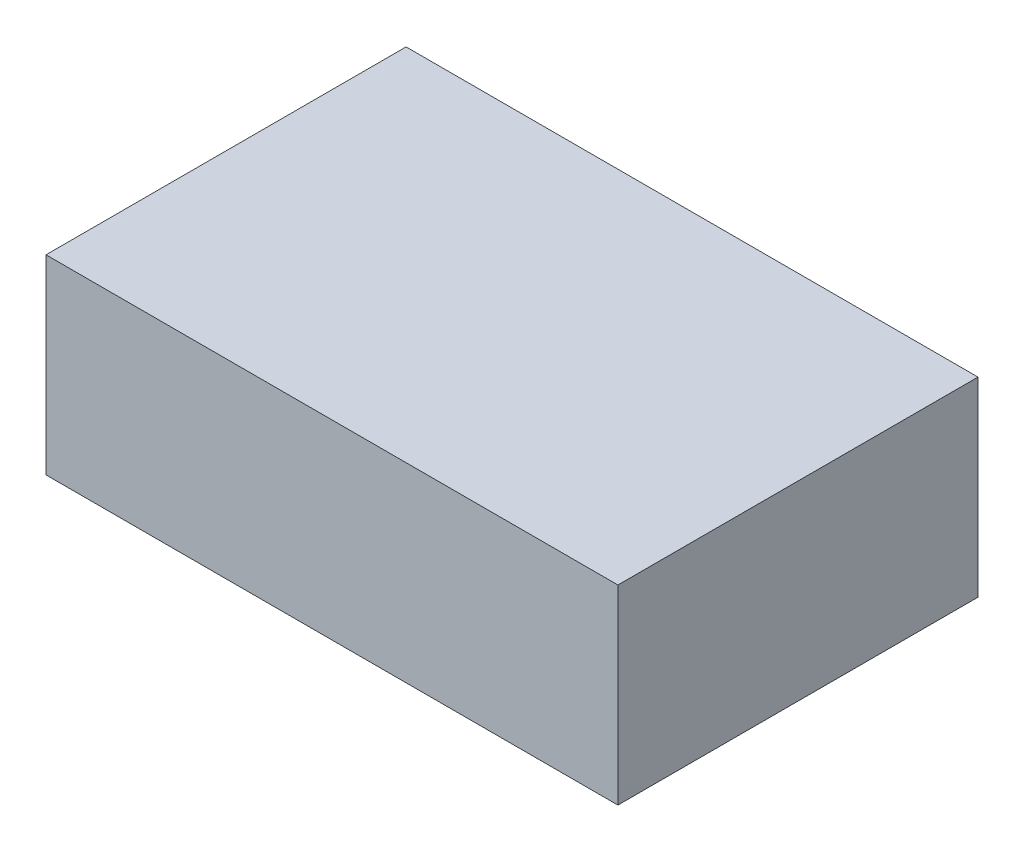
ISO-10303-21;
HEADER;
FILE_DESCRIPTION(('STEP AP214'),'2;1');
FILE_NAME('part.step','',(''),(''),'','','');
FILE_SCHEMA(('AUTOMOTIVE_DESIGN { 1 0 10303 214 1 1 1 1 }'));
ENDSEC;
DATA;
#1=APPLICATION_CONTEXT('core data for automotive mechanical design processes');
#2=APPLICATION_PROTOCOL_DEFINITION('international standard','automotive_design',2000,#1);
#3=PRODUCT_CONTEXT('',#1,'mechanical');
#4=PRODUCT('Part','Part','',(#3));
#5=PRODUCT_RELATED_PRODUCT_CATEGORY('part','',(#4));
#6=PRODUCT_DEFINITION_FORMATION('','',#4);
#7=PRODUCT_DEFINITION_CONTEXT('part definition',#1,'design');
#8=PRODUCT_DEFINITION('design','',#6,#7);
#9=PRODUCT_DEFINITION_SHAPE('','',#8);
#10=(LENGTH_UNIT() NAMED_UNIT(*) SI_UNIT(.MILLI.,.METRE.));
#11=(NAMED_UNIT(*) PLANE_ANGLE_UNIT() SI_UNIT($,.RADIAN.));
#12=(NAMED_UNIT(*) SI_UNIT($,.STERADIAN.) SOLID_ANGLE_UNIT());
#13=UNCERTAINTY_MEASURE_WITH_UNIT(LENGTH_MEASURE(1.E-05),#10,'distance_accuracy_value','');
#14=(GEOMETRIC_REPRESENTATION_CONTEXT(3) GLOBAL_UNCERTAINTY_ASSIGNED_CONTEXT((#13)) GLOBAL_UNIT_ASSIGNED_CONTEXT((#10,
#11,#12)) REPRESENTATION_CONTEXT('',''));
#15=CARTESIAN_POINT('',(0.,0.,0.));
#16=DIRECTION('',(0.,0.,1.));
#17=DIRECTION('',(1.,0.,0.));
#18=AXIS2_PLACEMENT_3D('',#15,#16,#17);
#19=CARTESIAN_POINT('',(67.5,45.,-42.5));
#20=DIRECTION('',(-1.,0.,0.));
#21=DIRECTION('',(0.,0.,1.));
#22=AXIS2_PLACEMENT_3D('',#19,#20,#21);
#23=PLANE('',#22);
#24=DIRECTION('',(0.,0.,-1.));
#25=VECTOR('',#24,1.);
#26=CARTESIAN_POINT('',(67.5,0.,-42.5));
#27=LINE('',#26,#25);
#28=CARTESIAN_POINT('',(67.5,0.,42.5));
#29=VERTEX_POINT('',#28);
#30=CARTESIAN_POINT('',(67.5,0.,-42.5));
#31=VERTEX_POINT('',#30);
#32=EDGE_CURVE('E100',#29,#31,#27,.T.);
#33=ORIENTED_EDGE('',*,*,#32,.T.);
#34=DIRECTION('',(0.,-1.,0.));
#35=VECTOR('',#34,1.);
#36=CARTESIAN_POINT('',(67.5,45.,-42.5));
#37=LINE('',#36,#35);
#38=CARTESIAN_POINT('',(67.5,45.,-42.5));
#39=VERTEX_POINT('',#38);
#40=EDGE_CURVE('E11',#39,#31,#37,.T.);
#41=ORIENTED_EDGE('',*,*,#40,.F.);
#42=DIRECTION('',(0.,0.,-1.));
#43=VECTOR('',#42,1.);
#44=CARTESIAN_POINT('',(67.5,45.,-42.5));
#45=LINE('',#44,#43);
#46=CARTESIAN_POINT('',(67.5,45.,42.5));
#47=VERTEX_POINT('',#46);
#48=EDGE_CURVE('E88',#47,#39,#45,.T.);
#49=ORIENTED_EDGE('',*,*,#48,.F.);
#50=DIRECTION('',(0.,-1.,0.));
#51=VECTOR('',#50,1.);
#52=CARTESIAN_POINT('',(67.5,45.,42.5));
#53=LINE('',#52,#51);
#54=EDGE_CURVE('E96',#47,#29,#53,.T.);
#55=ORIENTED_EDGE('',*,*,#54,.T.);
#56=EDGE_LOOP('',(#33,#41,#49,#55));
#57=FACE_BOUND('',#56,.T.);
#58=ADVANCED_FACE('F37',(#57),#23,.F.);
#59=CARTESIAN_POINT('',(-67.5,45.,-42.5));
#60=DIRECTION('',(0.,0.,1.));
#61=DIRECTION('',(1.,0.,0.));
#62=AXIS2_PLACEMENT_3D('',#59,#60,#61);
#63=PLANE('',#62);
#64=DIRECTION('',(-1.,0.,0.));
#65=VECTOR('',#64,1.);
#66=CARTESIAN_POINT('',(-67.5,0.,-42.5));
#67=LINE('',#66,#65);
#68=CARTESIAN_POINT('',(-67.5,0.,-42.5));
#69=VERTEX_POINT('',#68);
#70=EDGE_CURVE('E92',#31,#69,#67,.T.);
#71=ORIENTED_EDGE('',*,*,#70,.T.);
#72=DIRECTION('',(0.,-1.,0.));
#73=VECTOR('',#72,1.);
#74=CARTESIAN_POINT('',(-67.5,45.,-42.5));
#75=LINE('',#74,#73);
#76=CARTESIAN_POINT('',(-67.5,45.,-42.5));
#77=VERTEX_POINT('',#76);
#78=EDGE_CURVE('E45',#77,#69,#75,.T.);
#79=ORIENTED_EDGE('',*,*,#78,.F.);
#80=DIRECTION('',(-1.,0.,0.));
#81=VECTOR('',#80,1.);
#82=CARTESIAN_POINT('',(-67.5,45.,-42.5));
#83=LINE('',#82,#81);
#84=EDGE_CURVE('E83',#39,#77,#83,.T.);
#85=ORIENTED_EDGE('',*,*,#84,.F.);
#86=ORIENTED_EDGE('',*,*,#40,.T.);
#87=EDGE_LOOP('',(#71,#79,#85,#86));
#88=FACE_BOUND('',#87,.T.);
#89=ADVANCED_FACE('F91',(#88),#63,.F.);
#90=CARTESIAN_POINT('',(-67.5,45.,-42.5));
#91=DIRECTION('',(1.,0.,0.));
#92=DIRECTION('',(0.,0.,-1.));
#93=AXIS2_PLACEMENT_3D('',#90,#91,#92);
#94=PLANE('',#93);
#95=DIRECTION('',(0.,0.,1.));
#96=VECTOR('',#95,1.);
#97=CARTESIAN_POINT('',(-67.5,0.,-42.5));
#98=LINE('',#97,#96);
#99=CARTESIAN_POINT('',(-67.5,0.,42.5));
#100=VERTEX_POINT('',#99);
#101=EDGE_CURVE('E70',#69,#100,#98,.T.);
#102=ORIENTED_EDGE('',*,*,#101,.T.);
#103=DIRECTION('',(0.,-1.,0.));
#104=VECTOR('',#103,1.);
#105=CARTESIAN_POINT('',(-67.5,45.,42.5));
#106=LINE('',#105,#104);
#107=CARTESIAN_POINT('',(-67.5,45.,42.5));
#108=VERTEX_POINT('',#107);
#109=EDGE_CURVE('E93',#108,#100,#106,.T.);
#110=ORIENTED_EDGE('',*,*,#109,.F.);
#111=DIRECTION('',(0.,0.,1.));
#112=VECTOR('',#111,1.);
#113=CARTESIAN_POINT('',(-67.5,45.,-42.5));
#114=LINE('',#113,#112);
#115=EDGE_CURVE('E86',#77,#108,#114,.T.);
#116=ORIENTED_EDGE('',*,*,#115,.F.);
#117=ORIENTED_EDGE('',*,*,#78,.T.);
#118=EDGE_LOOP('',(#102,#110,#116,#117));
#119=FACE_BOUND('',#118,.T.);
#120=ADVANCED_FACE('F94',(#119),#94,.F.);
#121=CARTESIAN_POINT('',(-67.5,45.,42.5));
#122=DIRECTION('',(0.,0.,-1.));
#123=DIRECTION('',(-1.,0.,0.));
#124=AXIS2_PLACEMENT_3D('',#121,#122,#123);
#125=PLANE('',#124);
#126=DIRECTION('',(1.,0.,0.));
#127=VECTOR('',#126,1.);
#128=CARTESIAN_POINT('',(-67.5,0.,42.5));
#129=LINE('',#128,#127);
#130=EDGE_CURVE('E76',#100,#29,#129,.T.);
#131=ORIENTED_EDGE('',*,*,#130,.T.);
#132=ORIENTED_EDGE('',*,*,#54,.F.);
#133=DIRECTION('',(1.,0.,0.));
#134=VECTOR('',#133,1.);
#135=CARTESIAN_POINT('',(-67.5,45.,42.5));
#136=LINE('',#135,#134);
#137=EDGE_CURVE('E53',#108,#47,#136,.T.);
#138=ORIENTED_EDGE('',*,*,#137,.F.);
#139=ORIENTED_EDGE('',*,*,#109,.T.);
#140=EDGE_LOOP('',(#131,#132,#138,#139));
#141=FACE_BOUND('',#140,.T.);
#142=ADVANCED_FACE('F107',(#141),#125,.F.);
#143=CARTESIAN_POINT('',(0.,45.,0.));
#144=DIRECTION('',(0.,1.,0.));
#145=DIRECTION('',(0.,0.,1.));
#146=AXIS2_PLACEMENT_3D('',#143,#144,#145);
#147=PLANE('',#146);
#148=ORIENTED_EDGE('',*,*,#48,.T.);
#149=ORIENTED_EDGE('',*,*,#84,.T.);
#150=ORIENTED_EDGE('',*,*,#115,.T.);
#151=ORIENTED_EDGE('',*,*,#137,.T.);
#152=EDGE_LOOP('',(#148,#149,#150,#151));
#153=FACE_BOUND('',#152,.T.);
#154=ADVANCED_FACE('F84',(#153),#147,.T.);
#155=CARTESIAN_POINT('',(0.,0.,0.));
#156=DIRECTION('',(0.,1.,0.));
#157=DIRECTION('',(0.,0.,1.));
#158=AXIS2_PLACEMENT_3D('',#155,#156,#157);
#159=PLANE('',#158);
#160=ORIENTED_EDGE('',*,*,#32,.F.);
#161=ORIENTED_EDGE('',*,*,#130,.F.);
#162=ORIENTED_EDGE('',*,*,#101,.F.);
#163=ORIENTED_EDGE('',*,*,#70,.F.);
#164=EDGE_LOOP('',(#160,#161,#162,#163));
#165=FACE_BOUND('',#164,.T.);
#166=ADVANCED_FACE('F110',(#165),#159,.F.);
#167=CLOSED_SHELL('',(#58,#89,#120,#142,#154,#166));
#168=MANIFOLD_SOLID_BREP('B2',#167);
#169=ADVANCED_BREP_SHAPE_REPRESENTATION('',(#18,#168),#14);
#170=SHAPE_DEFINITION_REPRESENTATION(#9,#169);
ENDSEC;
END-ISO-10303-21;
